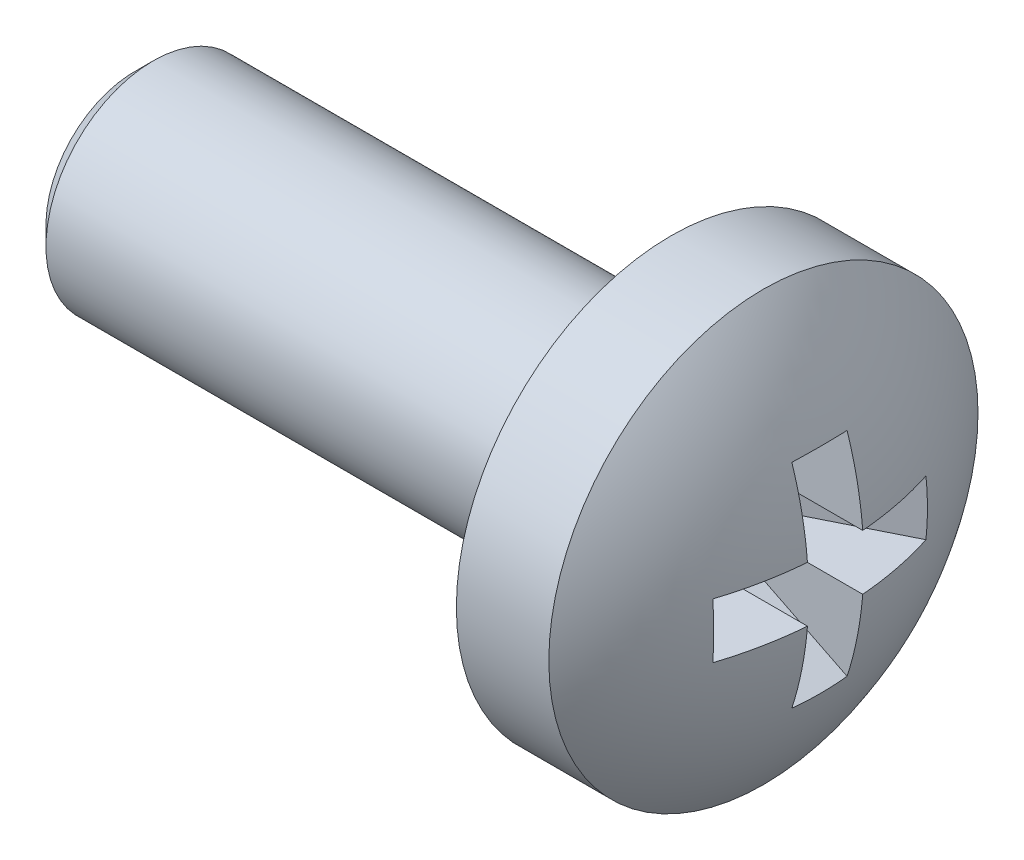
ISO-10303-21;
HEADER;
FILE_DESCRIPTION(('STEP AP214'),'2;1');
FILE_NAME('part.step','',(''),(''),'','','');
FILE_SCHEMA(('AUTOMOTIVE_DESIGN { 1 0 10303 214 1 1 1 1 }'));
ENDSEC;
DATA;
#1=APPLICATION_CONTEXT('core data for automotive mechanical design processes');
#2=APPLICATION_PROTOCOL_DEFINITION('international standard','automotive_design',2000,#1);
#3=PRODUCT_CONTEXT('',#1,'mechanical');
#4=PRODUCT('Part','Part','',(#3));
#5=PRODUCT_RELATED_PRODUCT_CATEGORY('part','',(#4));
#6=PRODUCT_DEFINITION_FORMATION('','',#4);
#7=PRODUCT_DEFINITION_CONTEXT('part definition',#1,'design');
#8=PRODUCT_DEFINITION('design','',#6,#7);
#9=PRODUCT_DEFINITION_SHAPE('','',#8);
#10=(LENGTH_UNIT() NAMED_UNIT(*) SI_UNIT(.MILLI.,.METRE.));
#11=(NAMED_UNIT(*) PLANE_ANGLE_UNIT() SI_UNIT($,.RADIAN.));
#12=(NAMED_UNIT(*) SI_UNIT($,.STERADIAN.) SOLID_ANGLE_UNIT());
#13=UNCERTAINTY_MEASURE_WITH_UNIT(LENGTH_MEASURE(1.E-05),#10,'distance_accuracy_value','');
#14=(GEOMETRIC_REPRESENTATION_CONTEXT(3) GLOBAL_UNCERTAINTY_ASSIGNED_CONTEXT((#13)) GLOBAL_UNIT_ASSIGNED_CONTEXT((#10,
#11,#12)) REPRESENTATION_CONTEXT('',''));
#15=CARTESIAN_POINT('',(0.,0.,0.));
#16=DIRECTION('',(0.,0.,1.));
#17=DIRECTION('',(1.,0.,0.));
#18=AXIS2_PLACEMENT_3D('',#15,#16,#17);
#19=CARTESIAN_POINT('',(-6.5,0.,0.));
#20=DIRECTION('',(1.,0.,0.));
#21=DIRECTION('',(0.,-1.,0.));
#22=AXIS2_PLACEMENT_3D('',#19,#20,#21);
#23=SPHERICAL_SURFACE('',#22,6.5);
#24=CARTESIAN_POINT('',(-6.06443199854499,0.,-0.873614257765256));
#25=DIRECTION('',(0.446197813109809,0.,-0.894934361602025));
#26=DIRECTION('',(-0.894934361602025,0.,-0.446197813109809));
#27=AXIS2_PLACEMENT_3D('',#24,#25,#26);
#28=CIRCLE('',#27,6.42628031171515);
#29=CARTESIAN_POINT('',(-0.331830512486634,0.515,1.98455540948322));
#30=VERTEX_POINT('',#29);
#31=CARTESIAN_POINT('',(-0.331830512486634,-0.515,1.98455540948322));
#32=VERTEX_POINT('',#31);
#33=EDGE_CURVE('E195',#30,#32,#28,.T.);
#34=ORIENTED_EDGE('',*,*,#33,.F.);
#35=CARTESIAN_POINT('',(-6.5,0.515,0.));
#36=DIRECTION('',(0.,-1.,0.));
#37=DIRECTION('',(0.,0.,-1.));
#38=AXIS2_PLACEMENT_3D('',#35,#36,#37);
#39=CIRCLE('',#38,6.47956595768575);
#40=CARTESIAN_POINT('',(-0.0409327298750029,0.515,0.515));
#41=VERTEX_POINT('',#40);
#42=EDGE_CURVE('E114',#30,#41,#39,.F.);
#43=ORIENTED_EDGE('',*,*,#42,.T.);
#44=CARTESIAN_POINT('',(-6.5,0.,0.515));
#45=DIRECTION('',(0.,0.,1.));
#46=DIRECTION('',(0.,-1.,0.));
#47=AXIS2_PLACEMENT_3D('',#44,#45,#46);
#48=CIRCLE('',#47,6.47956595768575);
#49=CARTESIAN_POINT('',(-0.331830512486634,1.98455540948322,0.515));
#50=VERTEX_POINT('',#49);
#51=EDGE_CURVE('E146',#50,#41,#48,.F.);
#52=ORIENTED_EDGE('',*,*,#51,.F.);
#53=CARTESIAN_POINT('',(-6.06443199854499,-0.873614257765256,0.));
#54=DIRECTION('',(0.446197813109809,-0.894934361602025,0.));
#55=DIRECTION('',(0.894934361602025,0.446197813109809,0.));
#56=AXIS2_PLACEMENT_3D('',#53,#54,#55);
#57=CIRCLE('',#56,6.42628031171515);
#58=CARTESIAN_POINT('',(-0.331830512486634,1.98455540948322,-0.515));
#59=VERTEX_POINT('',#58);
#60=EDGE_CURVE('E143',#50,#59,#57,.F.);
#61=ORIENTED_EDGE('',*,*,#60,.T.);
#62=CARTESIAN_POINT('',(-6.5,0.,-0.515));
#63=DIRECTION('',(0.,0.,1.));
#64=DIRECTION('',(0.,-1.,0.));
#65=AXIS2_PLACEMENT_3D('',#62,#63,#64);
#66=CIRCLE('',#65,6.47956595768575);
#67=CARTESIAN_POINT('',(-0.0409327298750029,0.515,-0.515));
#68=VERTEX_POINT('',#67);
#69=EDGE_CURVE('E147',#59,#68,#66,.F.);
#70=ORIENTED_EDGE('',*,*,#69,.T.);
#71=CARTESIAN_POINT('',(-6.5,0.515,0.));
#72=DIRECTION('',(0.,-1.,0.));
#73=DIRECTION('',(0.,0.,-1.));
#74=AXIS2_PLACEMENT_3D('',#71,#72,#73);
#75=CIRCLE('',#74,6.47956595768575);
#76=CARTESIAN_POINT('',(-0.331830512486634,0.515,-1.98455540948322));
#77=VERTEX_POINT('',#76);
#78=EDGE_CURVE('E197',#68,#77,#75,.F.);
#79=ORIENTED_EDGE('',*,*,#78,.T.);
#80=CARTESIAN_POINT('',(-6.06443199854499,0.,0.873614257765255));
#81=DIRECTION('',(0.446197813109809,0.,0.894934361602025));
#82=DIRECTION('',(0.894934361602025,0.,-0.446197813109809));
#83=AXIS2_PLACEMENT_3D('',#80,#81,#82);
#84=CIRCLE('',#83,6.42628031171515);
#85=CARTESIAN_POINT('',(-0.331830512486634,-0.515,-1.98455540948322));
#86=VERTEX_POINT('',#85);
#87=EDGE_CURVE('E200',#77,#86,#84,.F.);
#88=ORIENTED_EDGE('',*,*,#87,.T.);
#89=CARTESIAN_POINT('',(-6.5,-0.515,0.));
#90=DIRECTION('',(0.,-1.,0.));
#91=DIRECTION('',(0.,0.,-1.));
#92=AXIS2_PLACEMENT_3D('',#89,#90,#91);
#93=CIRCLE('',#92,6.47956595768575);
#94=CARTESIAN_POINT('',(-0.0409327298750029,-0.515,-0.515));
#95=VERTEX_POINT('',#94);
#96=EDGE_CURVE('E201',#95,#86,#93,.F.);
#97=ORIENTED_EDGE('',*,*,#96,.F.);
#98=CARTESIAN_POINT('',(-6.5,0.,-0.515));
#99=DIRECTION('',(0.,0.,1.));
#100=DIRECTION('',(0.,-1.,0.));
#101=AXIS2_PLACEMENT_3D('',#98,#99,#100);
#102=CIRCLE('',#101,6.47956595768575);
#103=CARTESIAN_POINT('',(-0.331830512486634,-1.98455540948322,-0.515));
#104=VERTEX_POINT('',#103);
#105=EDGE_CURVE('E157',#95,#104,#102,.F.);
#106=ORIENTED_EDGE('',*,*,#105,.T.);
#107=CARTESIAN_POINT('',(-6.06443199854499,0.873614257765256,0.));
#108=DIRECTION('',(0.446197813109809,0.894934361602025,0.));
#109=DIRECTION('',(-0.894934361602025,0.446197813109809,0.));
#110=AXIS2_PLACEMENT_3D('',#107,#108,#109);
#111=CIRCLE('',#110,6.42628031171515);
#112=CARTESIAN_POINT('',(-0.331830512486634,-1.98455540948322,0.515));
#113=VERTEX_POINT('',#112);
#114=EDGE_CURVE('E154',#113,#104,#111,.T.);
#115=ORIENTED_EDGE('',*,*,#114,.F.);
#116=CARTESIAN_POINT('',(-6.5,0.,0.515));
#117=DIRECTION('',(0.,0.,1.));
#118=DIRECTION('',(0.,-1.,0.));
#119=AXIS2_PLACEMENT_3D('',#116,#117,#118);
#120=CIRCLE('',#119,6.47956595768575);
#121=CARTESIAN_POINT('',(-0.0409327298750029,-0.515,0.515));
#122=VERTEX_POINT('',#121);
#123=EDGE_CURVE('E158',#122,#113,#120,.F.);
#124=ORIENTED_EDGE('',*,*,#123,.F.);
#125=CARTESIAN_POINT('',(-6.5,-0.515,0.));
#126=DIRECTION('',(0.,-1.,0.));
#127=DIRECTION('',(0.,0.,-1.));
#128=AXIS2_PLACEMENT_3D('',#125,#126,#127);
#129=CIRCLE('',#128,6.47956595768575);
#130=EDGE_CURVE('E193',#32,#122,#129,.F.);
#131=ORIENTED_EDGE('',*,*,#130,.F.);
#132=EDGE_LOOP('',(#34,#43,#52,#61,#70,#79,#88,#97,#106,#115,#124,#131));
#133=FACE_BOUND('',#132,.T.);
#134=CARTESIAN_POINT('',(-1.3765246170202,0.,0.));
#135=DIRECTION('',(1.,0.,0.));
#136=DIRECTION('',(0.,1.,0.));
#137=AXIS2_PLACEMENT_3D('',#134,#135,#136);
#138=CIRCLE('',#137,4.);
#139=CARTESIAN_POINT('',(-1.3765246170202,4.,0.));
#140=VERTEX_POINT('',#139);
#141=EDGE_CURVE('E118',#140,#140,#138,.T.);
#142=ORIENTED_EDGE('',*,*,#141,.T.);
#143=EDGE_LOOP('',(#142));
#144=FACE_BOUND('',#143,.T.);
#145=ADVANCED_FACE('F16',(#133,#144),#23,.T.);
#146=CARTESIAN_POINT('',(-13.1,0.,0.));
#147=DIRECTION('',(-1.,0.,0.));
#148=DIRECTION('',(0.,-1.,0.));
#149=AXIS2_PLACEMENT_3D('',#146,#147,#148);
#150=PLANE('',#149);
#151=CARTESIAN_POINT('',(-13.1,0.,0.));
#152=DIRECTION('',(-1.,0.,0.));
#153=DIRECTION('',(0.,-1.,0.));
#154=AXIS2_PLACEMENT_3D('',#151,#152,#153);
#155=CIRCLE('',#154,1.65);
#156=CARTESIAN_POINT('',(-13.1,-1.65,0.));
#157=VERTEX_POINT('',#156);
#158=EDGE_CURVE('E10',#157,#157,#155,.T.);
#159=ORIENTED_EDGE('',*,*,#158,.T.);
#160=EDGE_LOOP('',(#159));
#161=FACE_BOUND('',#160,.T.);
#162=ADVANCED_FACE('F262',(#161),#150,.T.);
#163=CARTESIAN_POINT('',(0.,0.,0.));
#164=DIRECTION('',(1.,0.,0.));
#165=DIRECTION('',(0.,1.,0.));
#166=AXIS2_PLACEMENT_3D('',#163,#164,#165);
#167=CYLINDRICAL_SURFACE('',#166,2.);
#168=CARTESIAN_POINT('',(-12.75,0.,0.));
#169=DIRECTION('',(-1.,0.,0.));
#170=DIRECTION('',(0.,-1.,0.));
#171=AXIS2_PLACEMENT_3D('',#168,#169,#170);
#172=CIRCLE('',#171,2.);
#173=CARTESIAN_POINT('',(-12.75,-2.,0.));
#174=VERTEX_POINT('',#173);
#175=EDGE_CURVE('E26',#174,#174,#172,.F.);
#176=ORIENTED_EDGE('',*,*,#175,.T.);
#177=EDGE_LOOP('',(#176));
#178=FACE_BOUND('',#177,.T.);
#179=CARTESIAN_POINT('',(-3.1,0.,0.));
#180=DIRECTION('',(1.,0.,0.));
#181=DIRECTION('',(0.,1.,0.));
#182=AXIS2_PLACEMENT_3D('',#179,#180,#181);
#183=CIRCLE('',#182,2.);
#184=CARTESIAN_POINT('',(-3.1,2.,0.));
#185=VERTEX_POINT('',#184);
#186=EDGE_CURVE('E190',#185,#185,#183,.T.);
#187=ORIENTED_EDGE('',*,*,#186,.F.);
#188=EDGE_LOOP('',(#187));
#189=FACE_BOUND('',#188,.T.);
#190=ADVANCED_FACE('F268',(#178,#189),#167,.T.);
#191=CARTESIAN_POINT('',(-3.1,2.,0.));
#192=DIRECTION('',(-1.,0.,0.));
#193=DIRECTION('',(0.,-1.,0.));
#194=AXIS2_PLACEMENT_3D('',#191,#192,#193);
#195=PLANE('',#194);
#196=ORIENTED_EDGE('',*,*,#186,.T.);
#197=EDGE_LOOP('',(#196));
#198=FACE_BOUND('',#197,.T.);
#199=CARTESIAN_POINT('',(-3.1,0.,0.));
#200=DIRECTION('',(1.,0.,0.));
#201=DIRECTION('',(0.,1.,0.));
#202=AXIS2_PLACEMENT_3D('',#199,#200,#201);
#203=CIRCLE('',#202,4.);
#204=CARTESIAN_POINT('',(-3.1,4.,0.));
#205=VERTEX_POINT('',#204);
#206=EDGE_CURVE('E187',#205,#205,#203,.T.);
#207=ORIENTED_EDGE('',*,*,#206,.F.);
#208=EDGE_LOOP('',(#207));
#209=FACE_BOUND('',#208,.T.);
#210=ADVANCED_FACE('F299',(#198,#209),#195,.T.);
#211=CARTESIAN_POINT('',(0.,0.,0.));
#212=DIRECTION('',(1.,0.,0.));
#213=DIRECTION('',(0.,1.,0.));
#214=AXIS2_PLACEMENT_3D('',#211,#212,#213);
#215=CYLINDRICAL_SURFACE('',#214,4.);
#216=ORIENTED_EDGE('',*,*,#206,.T.);
#217=EDGE_LOOP('',(#216));
#218=FACE_BOUND('',#217,.T.);
#219=ORIENTED_EDGE('',*,*,#141,.F.);
#220=EDGE_LOOP('',(#219));
#221=FACE_BOUND('',#220,.T.);
#222=ADVANCED_FACE('F296',(#218,#221),#215,.T.);
#223=CARTESIAN_POINT('',(0.,0.,2.15));
#224=DIRECTION('',(0.446197813109809,0.,-0.894934361602025));
#225=DIRECTION('',(-0.894934361602025,0.,-0.446197813109809));
#226=AXIS2_PLACEMENT_3D('',#223,#224,#225);
#227=PLANE('',#226);
#228=ORIENTED_EDGE('',*,*,#33,.T.);
#229=DIRECTION('',(-0.894934361602025,0.,-0.44619781310981));
#230=VECTOR('',#229,1.);
#231=CARTESIAN_POINT('',(0.,-0.515,2.15));
#232=LINE('',#231,#230);
#233=CARTESIAN_POINT('',(-2.34,-0.515,0.983319037154967));
#234=VERTEX_POINT('',#233);
#235=EDGE_CURVE('E35',#234,#32,#232,.F.);
#236=ORIENTED_EDGE('',*,*,#235,.F.);
#237=DIRECTION('',(0.,1.,0.));
#238=VECTOR('',#237,1.);
#239=CARTESIAN_POINT('',(-2.34,0.,0.983319037154967));
#240=LINE('',#239,#238);
#241=CARTESIAN_POINT('',(-2.34,0.515,0.983319037154967));
#242=VERTEX_POINT('',#241);
#243=EDGE_CURVE('E126',#242,#234,#240,.F.);
#244=ORIENTED_EDGE('',*,*,#243,.F.);
#245=DIRECTION('',(-0.894934361602025,0.,-0.44619781310981));
#246=VECTOR('',#245,1.);
#247=CARTESIAN_POINT('',(0.,0.515,2.15));
#248=LINE('',#247,#246);
#249=EDGE_CURVE('E107',#242,#30,#248,.F.);
#250=ORIENTED_EDGE('',*,*,#249,.T.);
#251=EDGE_LOOP('',(#228,#236,#244,#250));
#252=FACE_BOUND('',#251,.T.);
#253=ADVANCED_FACE('F18',(#252),#227,.T.);
#254=CARTESIAN_POINT('',(-2.34,0.515,0.));
#255=DIRECTION('',(0.,-1.,0.));
#256=DIRECTION('',(0.,0.,-1.));
#257=AXIS2_PLACEMENT_3D('',#254,#255,#256);
#258=PLANE('',#257);
#259=ORIENTED_EDGE('',*,*,#249,.F.);
#260=DIRECTION('',(0.,0.,-1.));
#261=VECTOR('',#260,1.);
#262=CARTESIAN_POINT('',(-2.34,0.515,0.));
#263=LINE('',#262,#261);
#264=CARTESIAN_POINT('',(-2.34,0.515,0.515));
#265=VERTEX_POINT('',#264);
#266=EDGE_CURVE('E111',#242,#265,#263,.T.);
#267=ORIENTED_EDGE('',*,*,#266,.T.);
#268=DIRECTION('',(1.,0.,0.));
#269=VECTOR('',#268,1.);
#270=CARTESIAN_POINT('',(-2.34,0.515,0.515));
#271=LINE('',#270,#269);
#272=EDGE_CURVE('E119',#265,#41,#271,.T.);
#273=ORIENTED_EDGE('',*,*,#272,.T.);
#274=ORIENTED_EDGE('',*,*,#42,.F.);
#275=EDGE_LOOP('',(#259,#267,#273,#274));
#276=FACE_BOUND('',#275,.T.);
#277=ADVANCED_FACE('F109',(#276),#258,.T.);
#278=CARTESIAN_POINT('',(-2.34,0.,0.515));
#279=DIRECTION('',(0.,0.,1.));
#280=DIRECTION('',(0.,-1.,0.));
#281=AXIS2_PLACEMENT_3D('',#278,#279,#280);
#282=PLANE('',#281);
#283=ORIENTED_EDGE('',*,*,#51,.T.);
#284=ORIENTED_EDGE('',*,*,#272,.F.);
#285=DIRECTION('',(0.,-1.,0.));
#286=VECTOR('',#285,1.);
#287=CARTESIAN_POINT('',(-2.34,0.,0.515));
#288=LINE('',#287,#286);
#289=CARTESIAN_POINT('',(-2.34,0.983319037154967,0.515));
#290=VERTEX_POINT('',#289);
#291=EDGE_CURVE('E129',#290,#265,#288,.T.);
#292=ORIENTED_EDGE('',*,*,#291,.F.);
#293=DIRECTION('',(0.894934361602025,0.44619781310981,0.));
#294=VECTOR('',#293,1.);
#295=CARTESIAN_POINT('',(-2.73265675038874,0.787547603133116,0.515));
#296=LINE('',#295,#294);
#297=EDGE_CURVE('E139',#290,#50,#296,.T.);
#298=ORIENTED_EDGE('',*,*,#297,.T.);
#299=EDGE_LOOP('',(#283,#284,#292,#298));
#300=FACE_BOUND('',#299,.T.);
#301=ADVANCED_FACE('F250',(#300),#282,.F.);
#302=CARTESIAN_POINT('',(0.,2.15,0.));
#303=DIRECTION('',(0.446197813109809,-0.894934361602025,0.));
#304=DIRECTION('',(0.894934361602025,0.446197813109809,0.));
#305=AXIS2_PLACEMENT_3D('',#302,#303,#304);
#306=PLANE('',#305);
#307=ORIENTED_EDGE('',*,*,#297,.F.);
#308=DIRECTION('',(0.,0.,-1.));
#309=VECTOR('',#308,1.);
#310=CARTESIAN_POINT('',(-2.34,0.983319037154967,0.));
#311=LINE('',#310,#309);
#312=CARTESIAN_POINT('',(-2.34,0.983319037154967,-0.515));
#313=VERTEX_POINT('',#312);
#314=EDGE_CURVE('E151',#290,#313,#311,.T.);
#315=ORIENTED_EDGE('',*,*,#314,.T.);
#316=DIRECTION('',(0.894934361602025,0.44619781310981,0.));
#317=VECTOR('',#316,1.);
#318=CARTESIAN_POINT('',(-2.73265675038874,0.787547603133116,-0.515));
#319=LINE('',#318,#317);
#320=EDGE_CURVE('E142',#313,#59,#319,.T.);
#321=ORIENTED_EDGE('',*,*,#320,.T.);
#322=ORIENTED_EDGE('',*,*,#60,.F.);
#323=EDGE_LOOP('',(#307,#315,#321,#322));
#324=FACE_BOUND('',#323,.T.);
#325=ADVANCED_FACE('F248',(#324),#306,.T.);
#326=CARTESIAN_POINT('',(-2.34,0.,-0.515));
#327=DIRECTION('',(0.,0.,1.));
#328=DIRECTION('',(0.,-1.,0.));
#329=AXIS2_PLACEMENT_3D('',#326,#327,#328);
#330=PLANE('',#329);
#331=ORIENTED_EDGE('',*,*,#320,.F.);
#332=DIRECTION('',(0.,-1.,0.));
#333=VECTOR('',#332,1.);
#334=CARTESIAN_POINT('',(-2.34,0.,-0.515));
#335=LINE('',#334,#333);
#336=CARTESIAN_POINT('',(-2.34,0.515,-0.515));
#337=VERTEX_POINT('',#336);
#338=EDGE_CURVE('E153',#313,#337,#335,.T.);
#339=ORIENTED_EDGE('',*,*,#338,.T.);
#340=DIRECTION('',(1.,0.,0.));
#341=VECTOR('',#340,1.);
#342=CARTESIAN_POINT('',(-2.34,0.515,-0.515));
#343=LINE('',#342,#341);
#344=EDGE_CURVE('E150',#337,#68,#343,.T.);
#345=ORIENTED_EDGE('',*,*,#344,.T.);
#346=ORIENTED_EDGE('',*,*,#69,.F.);
#347=EDGE_LOOP('',(#331,#339,#345,#346));
#348=FACE_BOUND('',#347,.T.);
#349=ADVANCED_FACE('F245',(#348),#330,.T.);
#350=CARTESIAN_POINT('',(-2.34,0.515,0.));
#351=DIRECTION('',(0.,-1.,0.));
#352=DIRECTION('',(0.,0.,-1.));
#353=AXIS2_PLACEMENT_3D('',#350,#351,#352);
#354=PLANE('',#353);
#355=ORIENTED_EDGE('',*,*,#344,.F.);
#356=DIRECTION('',(0.,0.,-1.));
#357=VECTOR('',#356,1.);
#358=CARTESIAN_POINT('',(-2.34,0.515,0.));
#359=LINE('',#358,#357);
#360=CARTESIAN_POINT('',(-2.34,0.515,-0.983319037154968));
#361=VERTEX_POINT('',#360);
#362=EDGE_CURVE('E173',#337,#361,#359,.T.);
#363=ORIENTED_EDGE('',*,*,#362,.T.);
#364=DIRECTION('',(0.894934361602025,0.,-0.44619781310981));
#365=VECTOR('',#364,1.);
#366=CARTESIAN_POINT('',(0.,0.515,-2.15));
#367=LINE('',#366,#365);
#368=EDGE_CURVE('E180',#361,#77,#367,.T.);
#369=ORIENTED_EDGE('',*,*,#368,.T.);
#370=ORIENTED_EDGE('',*,*,#78,.F.);
#371=EDGE_LOOP('',(#355,#363,#369,#370));
#372=FACE_BOUND('',#371,.T.);
#373=ADVANCED_FACE('F242',(#372),#354,.T.);
#374=CARTESIAN_POINT('',(0.,0.,-2.15));
#375=DIRECTION('',(0.446197813109809,0.,0.894934361602025));
#376=DIRECTION('',(0.894934361602025,0.,-0.446197813109809));
#377=AXIS2_PLACEMENT_3D('',#374,#375,#376);
#378=PLANE('',#377);
#379=ORIENTED_EDGE('',*,*,#368,.F.);
#380=DIRECTION('',(0.,-1.,0.));
#381=VECTOR('',#380,1.);
#382=CARTESIAN_POINT('',(-2.34,0.,-0.983319037154968));
#383=LINE('',#382,#381);
#384=CARTESIAN_POINT('',(-2.34,-0.515,-0.983319037154968));
#385=VERTEX_POINT('',#384);
#386=EDGE_CURVE('E172',#361,#385,#383,.T.);
#387=ORIENTED_EDGE('',*,*,#386,.T.);
#388=DIRECTION('',(0.894934361602025,0.,-0.44619781310981));
#389=VECTOR('',#388,1.);
#390=CARTESIAN_POINT('',(0.,-0.515,-2.15));
#391=LINE('',#390,#389);
#392=EDGE_CURVE('E182',#385,#86,#391,.T.);
#393=ORIENTED_EDGE('',*,*,#392,.T.);
#394=ORIENTED_EDGE('',*,*,#87,.F.);
#395=EDGE_LOOP('',(#379,#387,#393,#394));
#396=FACE_BOUND('',#395,.T.);
#397=ADVANCED_FACE('F236',(#396),#378,.T.);
#398=CARTESIAN_POINT('',(-2.34,-0.515,0.));
#399=DIRECTION('',(0.,-1.,0.));
#400=DIRECTION('',(0.,0.,-1.));
#401=AXIS2_PLACEMENT_3D('',#398,#399,#400);
#402=PLANE('',#401);
#403=ORIENTED_EDGE('',*,*,#96,.T.);
#404=ORIENTED_EDGE('',*,*,#392,.F.);
#405=DIRECTION('',(0.,0.,-1.));
#406=VECTOR('',#405,1.);
#407=CARTESIAN_POINT('',(-2.34,-0.515,0.));
#408=LINE('',#407,#406);
#409=CARTESIAN_POINT('',(-2.34,-0.515,-0.515));
#410=VERTEX_POINT('',#409);
#411=EDGE_CURVE('E165',#410,#385,#408,.T.);
#412=ORIENTED_EDGE('',*,*,#411,.F.);
#413=DIRECTION('',(1.,0.,0.));
#414=VECTOR('',#413,1.);
#415=CARTESIAN_POINT('',(-2.34,-0.515,-0.515));
#416=LINE('',#415,#414);
#417=EDGE_CURVE('E79',#410,#95,#416,.T.);
#418=ORIENTED_EDGE('',*,*,#417,.T.);
#419=EDGE_LOOP('',(#403,#404,#412,#418));
#420=FACE_BOUND('',#419,.T.);
#421=ADVANCED_FACE('F232',(#420),#402,.F.);
#422=CARTESIAN_POINT('',(-2.34,0.,-0.515));
#423=DIRECTION('',(0.,0.,1.));
#424=DIRECTION('',(0.,-1.,0.));
#425=AXIS2_PLACEMENT_3D('',#422,#423,#424);
#426=PLANE('',#425);
#427=ORIENTED_EDGE('',*,*,#417,.F.);
#428=DIRECTION('',(0.,-1.,0.));
#429=VECTOR('',#428,1.);
#430=CARTESIAN_POINT('',(-2.34,0.,-0.515));
#431=LINE('',#430,#429);
#432=CARTESIAN_POINT('',(-2.34,-0.983319037154967,-0.515));
#433=VERTEX_POINT('',#432);
#434=EDGE_CURVE('E73',#410,#433,#431,.T.);
#435=ORIENTED_EDGE('',*,*,#434,.T.);
#436=DIRECTION('',(-0.894934361602025,0.44619781310981,0.));
#437=VECTOR('',#436,1.);
#438=CARTESIAN_POINT('',(-2.73265675038874,-0.787547603133116,-0.515));
#439=LINE('',#438,#437);
#440=EDGE_CURVE('E20',#433,#104,#439,.F.);
#441=ORIENTED_EDGE('',*,*,#440,.T.);
#442=ORIENTED_EDGE('',*,*,#105,.F.);
#443=EDGE_LOOP('',(#427,#435,#441,#442));
#444=FACE_BOUND('',#443,.T.);
#445=ADVANCED_FACE('F228',(#444),#426,.T.);
#446=CARTESIAN_POINT('',(0.,-2.15,0.));
#447=DIRECTION('',(0.446197813109809,0.894934361602025,0.));
#448=DIRECTION('',(-0.894934361602025,0.446197813109809,0.));
#449=AXIS2_PLACEMENT_3D('',#446,#447,#448);
#450=PLANE('',#449);
#451=ORIENTED_EDGE('',*,*,#114,.T.);
#452=ORIENTED_EDGE('',*,*,#440,.F.);
#453=DIRECTION('',(0.,0.,1.));
#454=VECTOR('',#453,1.);
#455=CARTESIAN_POINT('',(-2.34,-0.983319037154967,0.));
#456=LINE('',#455,#454);
#457=CARTESIAN_POINT('',(-2.34,-0.983319037154967,0.515));
#458=VERTEX_POINT('',#457);
#459=EDGE_CURVE('E161',#458,#433,#456,.F.);
#460=ORIENTED_EDGE('',*,*,#459,.F.);
#461=DIRECTION('',(-0.894934361602025,0.44619781310981,0.));
#462=VECTOR('',#461,1.);
#463=CARTESIAN_POINT('',(-2.73265675038874,-0.787547603133116,0.515));
#464=LINE('',#463,#462);
#465=EDGE_CURVE('E159',#458,#113,#464,.F.);
#466=ORIENTED_EDGE('',*,*,#465,.T.);
#467=EDGE_LOOP('',(#451,#452,#460,#466));
#468=FACE_BOUND('',#467,.T.);
#469=ADVANCED_FACE('F227',(#468),#450,.T.);
#470=CARTESIAN_POINT('',(-2.34,0.,0.515));
#471=DIRECTION('',(0.,0.,1.));
#472=DIRECTION('',(0.,-1.,0.));
#473=AXIS2_PLACEMENT_3D('',#470,#471,#472);
#474=PLANE('',#473);
#475=ORIENTED_EDGE('',*,*,#123,.T.);
#476=ORIENTED_EDGE('',*,*,#465,.F.);
#477=DIRECTION('',(0.,-1.,0.));
#478=VECTOR('',#477,1.);
#479=CARTESIAN_POINT('',(-2.34,0.,0.515));
#480=LINE('',#479,#478);
#481=CARTESIAN_POINT('',(-2.34,-0.515,0.515));
#482=VERTEX_POINT('',#481);
#483=EDGE_CURVE('E133',#482,#458,#480,.T.);
#484=ORIENTED_EDGE('',*,*,#483,.F.);
#485=DIRECTION('',(1.,0.,0.));
#486=VECTOR('',#485,1.);
#487=CARTESIAN_POINT('',(-2.34,-0.515,0.515));
#488=LINE('',#487,#486);
#489=EDGE_CURVE('E138',#482,#122,#488,.T.);
#490=ORIENTED_EDGE('',*,*,#489,.T.);
#491=EDGE_LOOP('',(#475,#476,#484,#490));
#492=FACE_BOUND('',#491,.T.);
#493=ADVANCED_FACE('F225',(#492),#474,.F.);
#494=CARTESIAN_POINT('',(-2.34,-0.515,0.));
#495=DIRECTION('',(0.,-1.,0.));
#496=DIRECTION('',(0.,0.,-1.));
#497=AXIS2_PLACEMENT_3D('',#494,#495,#496);
#498=PLANE('',#497);
#499=ORIENTED_EDGE('',*,*,#130,.T.);
#500=ORIENTED_EDGE('',*,*,#489,.F.);
#501=DIRECTION('',(0.,0.,-1.));
#502=VECTOR('',#501,1.);
#503=CARTESIAN_POINT('',(-2.34,-0.515,0.));
#504=LINE('',#503,#502);
#505=EDGE_CURVE('E131',#234,#482,#504,.T.);
#506=ORIENTED_EDGE('',*,*,#505,.F.);
#507=ORIENTED_EDGE('',*,*,#235,.T.);
#508=EDGE_LOOP('',(#499,#500,#506,#507));
#509=FACE_BOUND('',#508,.T.);
#510=ADVANCED_FACE('F223',(#509),#498,.F.);
#511=CARTESIAN_POINT('',(-2.34,0.,0.));
#512=DIRECTION('',(1.,0.,0.));
#513=DIRECTION('',(0.,0.,-1.));
#514=AXIS2_PLACEMENT_3D('',#511,#512,#513);
#515=PLANE('',#514);
#516=ORIENTED_EDGE('',*,*,#243,.T.);
#517=ORIENTED_EDGE('',*,*,#505,.T.);
#518=ORIENTED_EDGE('',*,*,#483,.T.);
#519=ORIENTED_EDGE('',*,*,#459,.T.);
#520=ORIENTED_EDGE('',*,*,#434,.F.);
#521=ORIENTED_EDGE('',*,*,#411,.T.);
#522=ORIENTED_EDGE('',*,*,#386,.F.);
#523=ORIENTED_EDGE('',*,*,#362,.F.);
#524=ORIENTED_EDGE('',*,*,#338,.F.);
#525=ORIENTED_EDGE('',*,*,#314,.F.);
#526=ORIENTED_EDGE('',*,*,#291,.T.);
#527=ORIENTED_EDGE('',*,*,#266,.F.);
#528=EDGE_LOOP('',(#516,#517,#518,#519,#520,#521,#522,#523,#524,#525,#526,#527));
#529=FACE_BOUND('',#528,.T.);
#530=ADVANCED_FACE('F124',(#529),#515,.T.);
#531=CARTESIAN_POINT('',(-12.75,0.,0.));
#532=DIRECTION('',(1.,0.,0.));
#533=DIRECTION('',(0.,1.,0.));
#534=AXIS2_PLACEMENT_3D('',#531,#532,#533);
#535=CONICAL_SURFACE('',#534,2.,0.785398163397452);
#536=ORIENTED_EDGE('',*,*,#158,.F.);
#537=EDGE_LOOP('',(#536));
#538=FACE_BOUND('',#537,.T.);
#539=ORIENTED_EDGE('',*,*,#175,.F.);
#540=EDGE_LOOP('',(#539));
#541=FACE_BOUND('',#540,.T.);
#542=ADVANCED_FACE('F273',(#538,#541),#535,.T.);
#543=CLOSED_SHELL('',(#145,#162,#190,#210,#222,#253,#277,#301,#325,#349,#373,#397,#421,#445,
#469,#493,#510,#530,#542));
#544=MANIFOLD_SOLID_BREP('B1',#543);
#545=ADVANCED_BREP_SHAPE_REPRESENTATION('',(#18,#544),#14);
#546=SHAPE_DEFINITION_REPRESENTATION(#9,#545);
ENDSEC;
END-ISO-10303-21;
